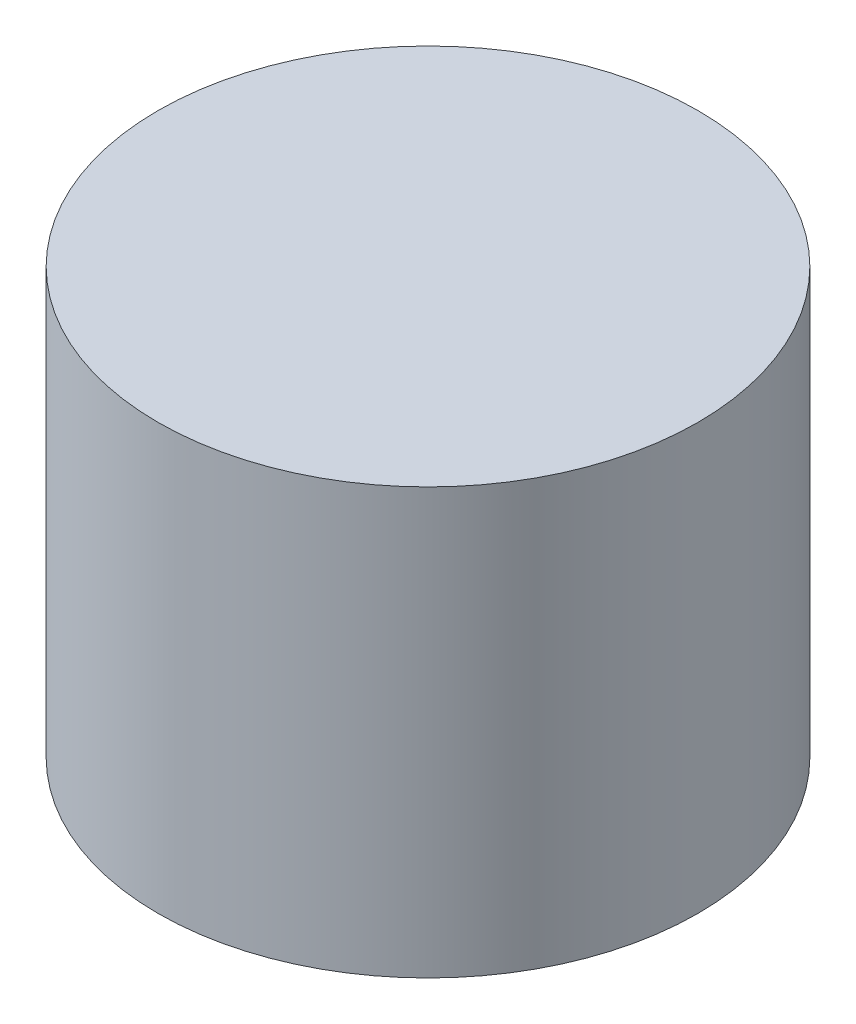
ISO-10303-21;
HEADER;
FILE_DESCRIPTION(('STEP AP214'),'2;1');
FILE_NAME('part.step','',(''),(''),'','','');
FILE_SCHEMA(('AUTOMOTIVE_DESIGN { 1 0 10303 214 1 1 1 1 }'));
ENDSEC;
DATA;
#1=APPLICATION_CONTEXT('core data for automotive mechanical design processes');
#2=APPLICATION_PROTOCOL_DEFINITION('international standard','automotive_design',2000,#1);
#3=PRODUCT_CONTEXT('',#1,'mechanical');
#4=PRODUCT('Part','Part','',(#3));
#5=PRODUCT_RELATED_PRODUCT_CATEGORY('part','',(#4));
#6=PRODUCT_DEFINITION_FORMATION('','',#4);
#7=PRODUCT_DEFINITION_CONTEXT('part definition',#1,'design');
#8=PRODUCT_DEFINITION('design','',#6,#7);
#9=PRODUCT_DEFINITION_SHAPE('','',#8);
#10=(LENGTH_UNIT() NAMED_UNIT(*) SI_UNIT(.MILLI.,.METRE.));
#11=(NAMED_UNIT(*) PLANE_ANGLE_UNIT() SI_UNIT($,.RADIAN.));
#12=(NAMED_UNIT(*) SI_UNIT($,.STERADIAN.) SOLID_ANGLE_UNIT());
#13=UNCERTAINTY_MEASURE_WITH_UNIT(LENGTH_MEASURE(1.E-05),#10,'distance_accuracy_value','');
#14=(GEOMETRIC_REPRESENTATION_CONTEXT(3) GLOBAL_UNCERTAINTY_ASSIGNED_CONTEXT((#13)) GLOBAL_UNIT_ASSIGNED_CONTEXT((#10,
#11,#12)) REPRESENTATION_CONTEXT('',''));
#15=CARTESIAN_POINT('',(0.,0.,0.));
#16=DIRECTION('',(0.,0.,1.));
#17=DIRECTION('',(1.,0.,0.));
#18=AXIS2_PLACEMENT_3D('',#15,#16,#17);
#19=CARTESIAN_POINT('',(0.,0.,0.));
#20=DIRECTION('',(0.,1.,0.));
#21=DIRECTION('',(0.,0.,1.));
#22=AXIS2_PLACEMENT_3D('',#19,#20,#21);
#23=PLANE('',#22);
#24=CARTESIAN_POINT('',(0.,0.,0.));
#25=DIRECTION('',(0.,1.,0.));
#26=DIRECTION('',(0.,0.,1.));
#27=AXIS2_PLACEMENT_3D('',#24,#25,#26);
#28=CIRCLE('',#27,1.);
#29=CARTESIAN_POINT('',(0.,0.,1.));
#30=VERTEX_POINT('',#29);
#31=EDGE_CURVE('E10',#30,#30,#28,.T.);
#32=ORIENTED_EDGE('',*,*,#31,.F.);
#33=EDGE_LOOP('',(#32));
#34=FACE_BOUND('',#33,.T.);
#35=ADVANCED_FACE('F43',(#34),#23,.F.);
#36=CARTESIAN_POINT('',(0.,1.,0.));
#37=DIRECTION('',(0.,1.,0.));
#38=DIRECTION('',(0.,0.,1.));
#39=AXIS2_PLACEMENT_3D('',#36,#37,#38);
#40=CYLINDRICAL_SURFACE('',#39,1.);
#41=CARTESIAN_POINT('',(0.,-1.52,0.));
#42=DIRECTION('',(0.,1.,0.));
#43=DIRECTION('',(0.,0.,1.));
#44=AXIS2_PLACEMENT_3D('',#41,#42,#43);
#45=CIRCLE('',#44,1.);
#46=CARTESIAN_POINT('',(0.,-1.52,1.));
#47=VERTEX_POINT('',#46);
#48=EDGE_CURVE('E50',#47,#47,#45,.T.);
#49=ORIENTED_EDGE('',*,*,#48,.F.);
#50=EDGE_LOOP('',(#49));
#51=FACE_BOUND('',#50,.T.);
#52=ORIENTED_EDGE('',*,*,#31,.T.);
#53=EDGE_LOOP('',(#52));
#54=FACE_BOUND('',#53,.T.);
#55=ADVANCED_FACE('F77',(#51,#54),#40,.F.);
#56=CARTESIAN_POINT('',(1.,-1.52,0.));
#57=DIRECTION('',(0.,1.,0.));
#58=DIRECTION('',(0.,0.,1.));
#59=AXIS2_PLACEMENT_3D('',#56,#57,#58);
#60=PLANE('',#59);
#61=CARTESIAN_POINT('',(0.,-1.52,0.));
#62=DIRECTION('',(0.,1.,0.));
#63=DIRECTION('',(0.,0.,1.));
#64=AXIS2_PLACEMENT_3D('',#61,#62,#63);
#65=CIRCLE('',#64,1.6);
#66=CARTESIAN_POINT('',(0.,-1.52,1.6));
#67=VERTEX_POINT('',#66);
#68=EDGE_CURVE('E55',#67,#67,#65,.T.);
#69=ORIENTED_EDGE('',*,*,#68,.F.);
#70=EDGE_LOOP('',(#69));
#71=FACE_BOUND('',#70,.T.);
#72=ORIENTED_EDGE('',*,*,#48,.T.);
#73=EDGE_LOOP('',(#72));
#74=FACE_BOUND('',#73,.T.);
#75=ADVANCED_FACE('F72',(#71,#74),#60,.F.);
#76=CARTESIAN_POINT('',(0.,1.,0.));
#77=DIRECTION('',(0.,1.,0.));
#78=DIRECTION('',(0.,0.,1.));
#79=AXIS2_PLACEMENT_3D('',#76,#77,#78);
#80=CYLINDRICAL_SURFACE('',#79,1.6);
#81=CARTESIAN_POINT('',(0.,1.,0.));
#82=DIRECTION('',(0.,1.,0.));
#83=DIRECTION('',(0.,0.,1.));
#84=AXIS2_PLACEMENT_3D('',#81,#82,#83);
#85=CIRCLE('',#84,1.6);
#86=CARTESIAN_POINT('',(0.,1.,1.6));
#87=VERTEX_POINT('',#86);
#88=EDGE_CURVE('E60',#87,#87,#85,.T.);
#89=ORIENTED_EDGE('',*,*,#88,.F.);
#90=EDGE_LOOP('',(#89));
#91=FACE_BOUND('',#90,.T.);
#92=ORIENTED_EDGE('',*,*,#68,.T.);
#93=EDGE_LOOP('',(#92));
#94=FACE_BOUND('',#93,.T.);
#95=ADVANCED_FACE('F69',(#91,#94),#80,.T.);
#96=CARTESIAN_POINT('',(1.6,1.,0.));
#97=DIRECTION('',(0.,-1.,0.));
#98=DIRECTION('',(0.,0.,-1.));
#99=AXIS2_PLACEMENT_3D('',#96,#97,#98);
#100=PLANE('',#99);
#101=ORIENTED_EDGE('',*,*,#88,.T.);
#102=EDGE_LOOP('',(#101));
#103=FACE_BOUND('',#102,.T.);
#104=ADVANCED_FACE('F67',(#103),#100,.F.);
#105=CLOSED_SHELL('',(#35,#55,#75,#95,#104));
#106=MANIFOLD_SOLID_BREP('B2',#105);
#107=ADVANCED_BREP_SHAPE_REPRESENTATION('',(#18,#106),#14);
#108=SHAPE_DEFINITION_REPRESENTATION(#9,#107);
ENDSEC;
END-ISO-10303-21;
